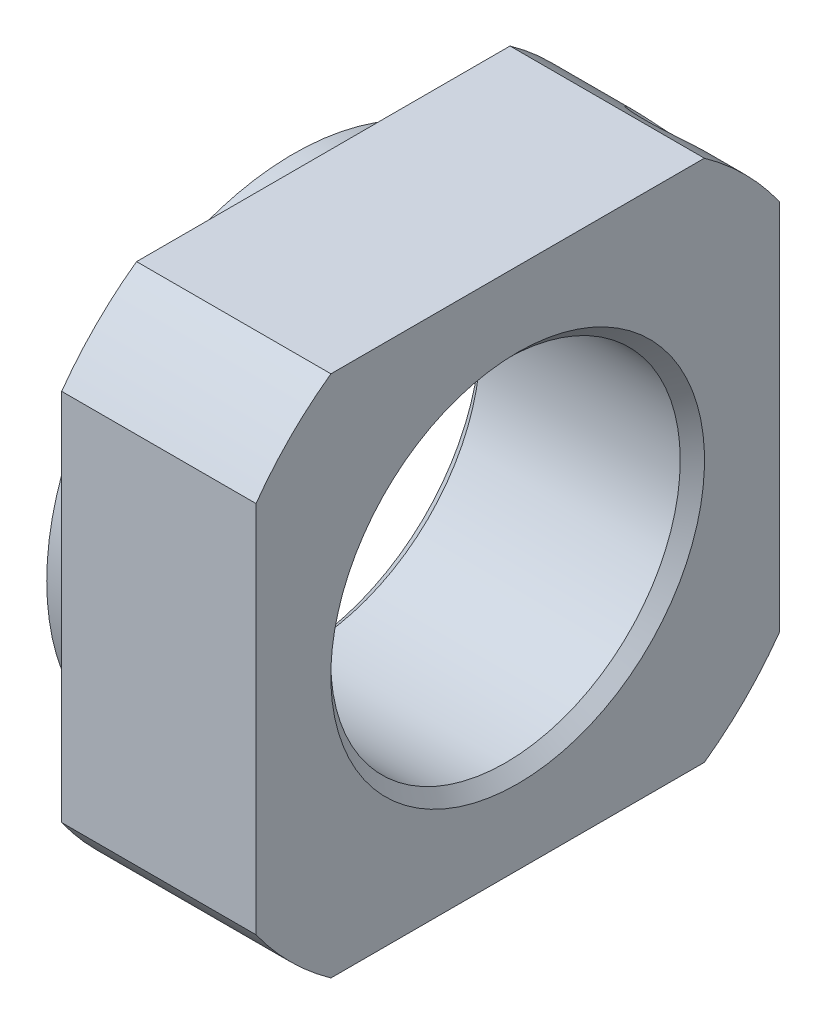
ISO-10303-21;
HEADER;
FILE_DESCRIPTION(('STEP AP214'),'2;1');
FILE_NAME('part.step','',(''),(''),'','','');
FILE_SCHEMA(('AUTOMOTIVE_DESIGN { 1 0 10303 214 1 1 1 1 }'));
ENDSEC;
DATA;
#1=APPLICATION_CONTEXT('core data for automotive mechanical design processes');
#2=APPLICATION_PROTOCOL_DEFINITION('international standard','automotive_design',2000,#1);
#3=PRODUCT_CONTEXT('',#1,'mechanical');
#4=PRODUCT('Part','Part','',(#3));
#5=PRODUCT_RELATED_PRODUCT_CATEGORY('part','',(#4));
#6=PRODUCT_DEFINITION_FORMATION('','',#4);
#7=PRODUCT_DEFINITION_CONTEXT('part definition',#1,'design');
#8=PRODUCT_DEFINITION('design','',#6,#7);
#9=PRODUCT_DEFINITION_SHAPE('','',#8);
#10=(LENGTH_UNIT() NAMED_UNIT(*) SI_UNIT(.MILLI.,.METRE.));
#11=(NAMED_UNIT(*) PLANE_ANGLE_UNIT() SI_UNIT($,.RADIAN.));
#12=(NAMED_UNIT(*) SI_UNIT($,.STERADIAN.) SOLID_ANGLE_UNIT());
#13=UNCERTAINTY_MEASURE_WITH_UNIT(LENGTH_MEASURE(1.E-05),#10,'distance_accuracy_value','');
#14=(GEOMETRIC_REPRESENTATION_CONTEXT(3) GLOBAL_UNCERTAINTY_ASSIGNED_CONTEXT((#13)) GLOBAL_UNIT_ASSIGNED_CONTEXT((#10,
#11,#12)) REPRESENTATION_CONTEXT('',''));
#15=CARTESIAN_POINT('',(0.,0.,0.));
#16=DIRECTION('',(0.,0.,1.));
#17=DIRECTION('',(1.,0.,0.));
#18=AXIS2_PLACEMENT_3D('',#15,#16,#17);
#19=CARTESIAN_POINT('',(0.,1.31838984174237E-13,-1.31838984174237E-13));
#20=DIRECTION('',(1.,0.,0.));
#21=DIRECTION('',(0.,0.,-1.));
#22=AXIS2_PLACEMENT_3D('',#19,#20,#21);
#23=PLANE('',#22);
#24=CARTESIAN_POINT('',(0.,0.,0.));
#25=DIRECTION('',(-1.,0.,0.));
#26=DIRECTION('',(0.,0.,1.));
#27=AXIS2_PLACEMENT_3D('',#24,#25,#26);
#28=CIRCLE('',#27,16.5);
#29=CARTESIAN_POINT('',(0.,0.,16.5));
#30=VERTEX_POINT('',#29);
#31=EDGE_CURVE('E168',#30,#30,#28,.T.);
#32=ORIENTED_EDGE('',*,*,#31,.F.);
#33=EDGE_LOOP('',(#32));
#34=FACE_BOUND('',#33,.T.);
#35=CARTESIAN_POINT('',(0.,-1.97758476261356E-13,-2.09901540593194E-13));
#36=DIRECTION('',(1.,0.,0.));
#37=DIRECTION('',(0.,0.,-1.));
#38=AXIS2_PLACEMENT_3D('',#35,#36,#37);
#39=CIRCLE('',#38,21.5000000000003);
#40=CARTESIAN_POINT('',(0.,17.5,12.4899959967968));
#41=VERTEX_POINT('',#40);
#42=CARTESIAN_POINT('',(0.,12.4899959967968,17.5));
#43=VERTEX_POINT('',#42);
#44=EDGE_CURVE('E165',#41,#43,#39,.T.);
#45=ORIENTED_EDGE('',*,*,#44,.F.);
#46=DIRECTION('',(0.,0.,-1.));
#47=VECTOR('',#46,1.);
#48=CARTESIAN_POINT('',(0.,17.5,-12.4899959967968));
#49=LINE('',#48,#47);
#50=CARTESIAN_POINT('',(0.,17.5,-12.4899959967968));
#51=VERTEX_POINT('',#50);
#52=EDGE_CURVE('E180',#41,#51,#49,.T.);
#53=ORIENTED_EDGE('',*,*,#52,.T.);
#54=CARTESIAN_POINT('',(0.,-2.09901540593194E-13,1.97758476261356E-13));
#55=DIRECTION('',(1.,0.,0.));
#56=DIRECTION('',(0.,0.,-1.));
#57=AXIS2_PLACEMENT_3D('',#54,#55,#56);
#58=CIRCLE('',#57,21.5000000000003);
#59=CARTESIAN_POINT('',(0.,12.4899959967968,-17.5));
#60=VERTEX_POINT('',#59);
#61=EDGE_CURVE('E171',#60,#51,#58,.T.);
#62=ORIENTED_EDGE('',*,*,#61,.F.);
#63=DIRECTION('',(0.,1.,0.));
#64=VECTOR('',#63,1.);
#65=CARTESIAN_POINT('',(0.,-12.4899959967968,-17.5));
#66=LINE('',#65,#64);
#67=CARTESIAN_POINT('',(0.,-12.4899959967968,-17.5));
#68=VERTEX_POINT('',#67);
#69=EDGE_CURVE('E177',#60,#68,#66,.F.);
#70=ORIENTED_EDGE('',*,*,#69,.T.);
#71=CARTESIAN_POINT('',(0.,2.46330733588707E-13,2.39391839684799E-13));
#72=DIRECTION('',(1.,0.,0.));
#73=DIRECTION('',(0.,0.,-1.));
#74=AXIS2_PLACEMENT_3D('',#71,#72,#73);
#75=CIRCLE('',#74,21.5000000000003);
#76=CARTESIAN_POINT('',(0.,-17.5,-12.4899959967967));
#77=VERTEX_POINT('',#76);
#78=EDGE_CURVE('E104',#77,#68,#75,.T.);
#79=ORIENTED_EDGE('',*,*,#78,.F.);
#80=DIRECTION('',(0.,0.,1.));
#81=VECTOR('',#80,1.);
#82=CARTESIAN_POINT('',(0.,-17.5,12.4899959967968));
#83=LINE('',#82,#81);
#84=CARTESIAN_POINT('',(0.,-17.5,12.4899959967968));
#85=VERTEX_POINT('',#84);
#86=EDGE_CURVE('E97',#77,#85,#83,.T.);
#87=ORIENTED_EDGE('',*,*,#86,.T.);
#88=CARTESIAN_POINT('',(0.,1.31838984174237E-13,-1.31838984174237E-13));
#89=DIRECTION('',(1.,0.,0.));
#90=DIRECTION('',(0.,0.,-1.));
#91=AXIS2_PLACEMENT_3D('',#88,#89,#90);
#92=CIRCLE('',#91,21.5000000000002);
#93=CARTESIAN_POINT('',(0.,-12.4899959967968,17.5));
#94=VERTEX_POINT('',#93);
#95=EDGE_CURVE('E19',#94,#85,#92,.T.);
#96=ORIENTED_EDGE('',*,*,#95,.F.);
#97=DIRECTION('',(0.,1.,0.));
#98=VECTOR('',#97,1.);
#99=CARTESIAN_POINT('',(0.,12.4899959967968,17.5));
#100=LINE('',#99,#98);
#101=EDGE_CURVE('E80',#94,#43,#100,.T.);
#102=ORIENTED_EDGE('',*,*,#101,.T.);
#103=EDGE_LOOP('',(#45,#53,#62,#70,#79,#87,#96,#102));
#104=FACE_BOUND('',#103,.T.);
#105=ADVANCED_FACE('F16',(#34,#104),#23,.F.);
#106=CARTESIAN_POINT('',(13.,12.4899959967968,17.5));
#107=DIRECTION('',(0.,0.,-1.));
#108=DIRECTION('',(-1.,0.,0.));
#109=AXIS2_PLACEMENT_3D('',#106,#107,#108);
#110=PLANE('',#109);
#111=DIRECTION('',(1.,0.,0.));
#112=VECTOR('',#111,1.);
#113=CARTESIAN_POINT('',(13.,-12.4899959967968,17.5));
#114=LINE('',#113,#112);
#115=CARTESIAN_POINT('',(13.,-12.4899959967968,17.5));
#116=VERTEX_POINT('',#115);
#117=EDGE_CURVE('E91',#116,#94,#114,.F.);
#118=ORIENTED_EDGE('',*,*,#117,.F.);
#119=DIRECTION('',(0.,1.,0.));
#120=VECTOR('',#119,1.);
#121=CARTESIAN_POINT('',(13.,1.31838984174237E-13,17.5));
#122=LINE('',#121,#120);
#123=CARTESIAN_POINT('',(13.,12.4899959967968,17.5));
#124=VERTEX_POINT('',#123);
#125=EDGE_CURVE('E159',#124,#116,#122,.F.);
#126=ORIENTED_EDGE('',*,*,#125,.F.);
#127=DIRECTION('',(1.,0.,0.));
#128=VECTOR('',#127,1.);
#129=CARTESIAN_POINT('',(13.,12.4899959967968,17.5));
#130=LINE('',#129,#128);
#131=EDGE_CURVE('E162',#43,#124,#130,.T.);
#132=ORIENTED_EDGE('',*,*,#131,.F.);
#133=ORIENTED_EDGE('',*,*,#101,.F.);
#134=EDGE_LOOP('',(#118,#126,#132,#133));
#135=FACE_BOUND('',#134,.T.);
#136=ADVANCED_FACE('F238',(#135),#110,.F.);
#137=CARTESIAN_POINT('',(13.,1.31838984174237E-13,-1.31838984174237E-13));
#138=DIRECTION('',(1.,0.,0.));
#139=DIRECTION('',(0.,0.,-1.));
#140=AXIS2_PLACEMENT_3D('',#137,#138,#139);
#141=CYLINDRICAL_SURFACE('',#140,21.5000000000002);
#142=CARTESIAN_POINT('',(13.,1.31838984174237E-13,-1.31838984174237E-13));
#143=DIRECTION('',(1.,0.,0.));
#144=DIRECTION('',(0.,0.,-1.));
#145=AXIS2_PLACEMENT_3D('',#142,#143,#144);
#146=CIRCLE('',#145,21.5000000000002);
#147=CARTESIAN_POINT('',(13.,-17.5,12.4899959967968));
#148=VERTEX_POINT('',#147);
#149=EDGE_CURVE('E158',#116,#148,#146,.T.);
#150=ORIENTED_EDGE('',*,*,#149,.F.);
#151=ORIENTED_EDGE('',*,*,#117,.T.);
#152=ORIENTED_EDGE('',*,*,#95,.T.);
#153=DIRECTION('',(1.,0.,0.));
#154=VECTOR('',#153,1.);
#155=CARTESIAN_POINT('',(13.,-17.5,12.4899959967968));
#156=LINE('',#155,#154);
#157=EDGE_CURVE('E89',#85,#148,#156,.T.);
#158=ORIENTED_EDGE('',*,*,#157,.T.);
#159=EDGE_LOOP('',(#150,#151,#152,#158));
#160=FACE_BOUND('',#159,.T.);
#161=ADVANCED_FACE('F88',(#160),#141,.T.);
#162=CARTESIAN_POINT('',(13.,-17.5,12.4899959967968));
#163=DIRECTION('',(0.,1.,0.));
#164=DIRECTION('',(0.,0.,1.));
#165=AXIS2_PLACEMENT_3D('',#162,#163,#164);
#166=PLANE('',#165);
#167=DIRECTION('',(1.,0.,0.));
#168=VECTOR('',#167,1.);
#169=CARTESIAN_POINT('',(13.,-17.5,-12.4899959967968));
#170=LINE('',#169,#168);
#171=CARTESIAN_POINT('',(13.,-17.5,-12.4899959967967));
#172=VERTEX_POINT('',#171);
#173=EDGE_CURVE('E106',#172,#77,#170,.F.);
#174=ORIENTED_EDGE('',*,*,#173,.F.);
#175=DIRECTION('',(0.,0.,-1.));
#176=VECTOR('',#175,1.);
#177=CARTESIAN_POINT('',(13.,-17.5,-1.31838984174237E-13));
#178=LINE('',#177,#176);
#179=EDGE_CURVE('E99',#148,#172,#178,.T.);
#180=ORIENTED_EDGE('',*,*,#179,.F.);
#181=ORIENTED_EDGE('',*,*,#157,.F.);
#182=ORIENTED_EDGE('',*,*,#86,.F.);
#183=EDGE_LOOP('',(#174,#180,#181,#182));
#184=FACE_BOUND('',#183,.T.);
#185=ADVANCED_FACE('F96',(#184),#166,.F.);
#186=CARTESIAN_POINT('',(13.,2.46330733588707E-13,2.39391839684799E-13));
#187=DIRECTION('',(1.,0.,0.));
#188=DIRECTION('',(0.,0.,-1.));
#189=AXIS2_PLACEMENT_3D('',#186,#187,#188);
#190=CYLINDRICAL_SURFACE('',#189,21.5000000000003);
#191=CARTESIAN_POINT('',(13.,2.46330733588707E-13,2.39391839684799E-13));
#192=DIRECTION('',(1.,0.,0.));
#193=DIRECTION('',(0.,0.,-1.));
#194=AXIS2_PLACEMENT_3D('',#191,#192,#193);
#195=CIRCLE('',#194,21.5000000000003);
#196=CARTESIAN_POINT('',(13.,-12.4899959967968,-17.5));
#197=VERTEX_POINT('',#196);
#198=EDGE_CURVE('E156',#172,#197,#195,.T.);
#199=ORIENTED_EDGE('',*,*,#198,.F.);
#200=ORIENTED_EDGE('',*,*,#173,.T.);
#201=ORIENTED_EDGE('',*,*,#78,.T.);
#202=DIRECTION('',(1.,0.,0.));
#203=VECTOR('',#202,1.);
#204=CARTESIAN_POINT('',(13.,-12.4899959967968,-17.5));
#205=LINE('',#204,#203);
#206=EDGE_CURVE('E174',#68,#197,#205,.T.);
#207=ORIENTED_EDGE('',*,*,#206,.T.);
#208=EDGE_LOOP('',(#199,#200,#201,#207));
#209=FACE_BOUND('',#208,.T.);
#210=ADVANCED_FACE('F230',(#209),#190,.T.);
#211=CARTESIAN_POINT('',(13.,-12.4899959967968,-17.5));
#212=DIRECTION('',(0.,0.,1.));
#213=DIRECTION('',(1.,0.,0.));
#214=AXIS2_PLACEMENT_3D('',#211,#212,#213);
#215=PLANE('',#214);
#216=DIRECTION('',(1.,0.,0.));
#217=VECTOR('',#216,1.);
#218=CARTESIAN_POINT('',(13.,12.4899959967968,-17.5));
#219=LINE('',#218,#217);
#220=CARTESIAN_POINT('',(13.,12.4899959967968,-17.5));
#221=VERTEX_POINT('',#220);
#222=EDGE_CURVE('E161',#221,#60,#219,.F.);
#223=ORIENTED_EDGE('',*,*,#222,.F.);
#224=DIRECTION('',(0.,1.,0.));
#225=VECTOR('',#224,1.);
#226=CARTESIAN_POINT('',(13.,1.31838984174237E-13,-17.5));
#227=LINE('',#226,#225);
#228=EDGE_CURVE('E154',#197,#221,#227,.T.);
#229=ORIENTED_EDGE('',*,*,#228,.F.);
#230=ORIENTED_EDGE('',*,*,#206,.F.);
#231=ORIENTED_EDGE('',*,*,#69,.F.);
#232=EDGE_LOOP('',(#223,#229,#230,#231));
#233=FACE_BOUND('',#232,.T.);
#234=ADVANCED_FACE('F226',(#233),#215,.F.);
#235=CARTESIAN_POINT('',(13.,17.5,-12.4899959967968));
#236=DIRECTION('',(0.,-1.,0.));
#237=DIRECTION('',(0.,0.,-1.));
#238=AXIS2_PLACEMENT_3D('',#235,#236,#237);
#239=PLANE('',#238);
#240=DIRECTION('',(1.,0.,0.));
#241=VECTOR('',#240,1.);
#242=CARTESIAN_POINT('',(13.,17.5,12.4899959967968));
#243=LINE('',#242,#241);
#244=CARTESIAN_POINT('',(13.,17.5,12.4899959967968));
#245=VERTEX_POINT('',#244);
#246=EDGE_CURVE('E164',#245,#41,#243,.F.);
#247=ORIENTED_EDGE('',*,*,#246,.F.);
#248=DIRECTION('',(0.,0.,-1.));
#249=VECTOR('',#248,1.);
#250=CARTESIAN_POINT('',(13.,17.5,-1.31838984174237E-13));
#251=LINE('',#250,#249);
#252=CARTESIAN_POINT('',(13.,17.5,-12.4899959967968));
#253=VERTEX_POINT('',#252);
#254=EDGE_CURVE('E34',#253,#245,#251,.F.);
#255=ORIENTED_EDGE('',*,*,#254,.F.);
#256=DIRECTION('',(1.,0.,0.));
#257=VECTOR('',#256,1.);
#258=CARTESIAN_POINT('',(13.,17.5,-12.4899959967968));
#259=LINE('',#258,#257);
#260=EDGE_CURVE('E169',#51,#253,#259,.T.);
#261=ORIENTED_EDGE('',*,*,#260,.F.);
#262=ORIENTED_EDGE('',*,*,#52,.F.);
#263=EDGE_LOOP('',(#247,#255,#261,#262));
#264=FACE_BOUND('',#263,.T.);
#265=ADVANCED_FACE('F223',(#264),#239,.F.);
#266=CARTESIAN_POINT('',(13.,-1.97758476261356E-13,-2.09901540593194E-13));
#267=DIRECTION('',(1.,0.,0.));
#268=DIRECTION('',(0.,0.,-1.));
#269=AXIS2_PLACEMENT_3D('',#266,#267,#268);
#270=CYLINDRICAL_SURFACE('',#269,21.5000000000003);
#271=CARTESIAN_POINT('',(13.,-1.97758476261356E-13,-2.09901540593194E-13));
#272=DIRECTION('',(1.,0.,0.));
#273=DIRECTION('',(0.,0.,-1.));
#274=AXIS2_PLACEMENT_3D('',#271,#272,#273);
#275=CIRCLE('',#274,21.5000000000003);
#276=EDGE_CURVE('E152',#245,#124,#275,.T.);
#277=ORIENTED_EDGE('',*,*,#276,.F.);
#278=ORIENTED_EDGE('',*,*,#246,.T.);
#279=ORIENTED_EDGE('',*,*,#44,.T.);
#280=ORIENTED_EDGE('',*,*,#131,.T.);
#281=EDGE_LOOP('',(#277,#278,#279,#280));
#282=FACE_BOUND('',#281,.T.);
#283=ADVANCED_FACE('F219',(#282),#270,.T.);
#284=CARTESIAN_POINT('',(0.,0.,0.));
#285=DIRECTION('',(-1.,0.,0.));
#286=DIRECTION('',(0.,0.,1.));
#287=AXIS2_PLACEMENT_3D('',#284,#285,#286);
#288=CYLINDRICAL_SURFACE('',#287,16.5);
#289=CARTESIAN_POINT('',(-2.,0.,0.));
#290=DIRECTION('',(-1.,0.,0.));
#291=DIRECTION('',(0.,0.,1.));
#292=AXIS2_PLACEMENT_3D('',#289,#290,#291);
#293=CIRCLE('',#292,16.5);
#294=CARTESIAN_POINT('',(-2.,0.,16.5));
#295=VERTEX_POINT('',#294);
#296=EDGE_CURVE('E194',#295,#295,#293,.F.);
#297=ORIENTED_EDGE('',*,*,#296,.T.);
#298=EDGE_LOOP('',(#297));
#299=FACE_BOUND('',#298,.T.);
#300=ORIENTED_EDGE('',*,*,#31,.T.);
#301=EDGE_LOOP('',(#300));
#302=FACE_BOUND('',#301,.T.);
#303=ADVANCED_FACE('F215',(#299,#302),#288,.T.);
#304=CARTESIAN_POINT('',(13.,-2.09901540593194E-13,1.97758476261356E-13));
#305=DIRECTION('',(1.,0.,0.));
#306=DIRECTION('',(0.,0.,-1.));
#307=AXIS2_PLACEMENT_3D('',#304,#305,#306);
#308=CYLINDRICAL_SURFACE('',#307,21.5000000000003);
#309=CARTESIAN_POINT('',(6.1747350924286,14.0157210768637,-16.303667154641));
#310=CARTESIAN_POINT('',(6.25940992751398,13.9504955141547,-16.3597396202765));
#311=CARTESIAN_POINT('',(6.35049471448669,13.8896843576139,-16.4113359702357));
#312=CARTESIAN_POINT('',(6.54328010452503,13.7782742153301,-16.5049832110584));
#313=CARTESIAN_POINT('',(6.64499075708883,13.7276850321972,-16.5470249440629));
#314=CARTESIAN_POINT('',(6.87348569327616,13.6307644211755,-16.6269910061141));
#315=CARTESIAN_POINT('',(7.00169332219604,13.5863662853314,-16.6632172685202));
#316=CARTESIAN_POINT('',(7.26569350229031,13.5140767740236,-16.7218989661425));
#317=CARTESIAN_POINT('',(7.40148854463858,13.4861908552808,-16.7443498491573));
#318=CARTESIAN_POINT('',(7.6819507250166,13.447028167969,-16.7758189268236));
#319=CARTESIAN_POINT('',(7.82676179210579,13.4363735574815,-16.7843340771249));
#320=CARTESIAN_POINT('',(8.11664708171829,13.4339231038293,-16.7862953085254));
#321=CARTESIAN_POINT('',(8.26172132333373,13.4421286884206,-16.7797402487782));
#322=CARTESIAN_POINT('',(8.55012110397777,13.477401580717,-16.7514227213695));
#323=CARTESIAN_POINT('',(8.69339451977887,13.5047287921443,-16.7294506926763));
#324=CARTESIAN_POINT('',(8.97193560480896,13.5776918518271,-16.6702872116577));
#325=CARTESIAN_POINT('',(9.1072030689178,13.6233281689467,-16.6330953695792));
#326=CARTESIAN_POINT('',(9.36419222546164,13.7309035445168,-16.5443971268616));
#327=CARTESIAN_POINT('',(9.48604435366008,13.7926613420942,-16.4930495462997));
#328=CARTESIAN_POINT('',(9.713893669666,13.9307587433339,-16.376571364044));
#329=CARTESIAN_POINT('',(9.81989368742322,14.0070957387353,-16.3114432275074));
#330=CARTESIAN_POINT('',(10.008644667855,14.1687497980693,-16.1711943873373));
#331=CARTESIAN_POINT('',(10.0921127697466,14.2536281554891,-16.0965345317792));
#332=CARTESIAN_POINT('',(10.237650908198,14.4317534115329,-15.9370241903251));
#333=CARTESIAN_POINT('',(10.2997291084287,14.5249971002807,-15.8521776090043));
#334=CARTESIAN_POINT('',(10.3971433525008,14.7113230505667,-15.6793563858264));
#335=CARTESIAN_POINT('',(10.4337617663573,14.8041324639282,-15.591810034069));
#336=CARTESIAN_POINT('',(10.4840809744757,14.9913030097015,-15.411932078091));
#337=CARTESIAN_POINT('',(10.4977888502517,15.085663653527,-15.3196019616051));
#338=CARTESIAN_POINT('',(10.5016320853983,15.2687998378727,-15.1370324176694));
#339=CARTESIAN_POINT('',(10.4927676107938,15.3576396942485,-15.0468769429352));
#340=CARTESIAN_POINT('',(10.4539142083268,15.5314461487663,-14.8674068657041));
#341=CARTESIAN_POINT('',(10.4239265086083,15.616412971788,-14.778092214626));
#342=CARTESIAN_POINT('',(10.3441347100633,15.7799634145458,-14.6033228278298));
#343=CARTESIAN_POINT('',(10.2944124260168,15.8585717951064,-14.5178537579477));
#344=CARTESIAN_POINT('',(10.1768976035304,16.0080857996612,-14.3528257239791));
#345=CARTESIAN_POINT('',(10.109102514355,16.0789903343702,-14.2732675961718));
#346=CARTESIAN_POINT('',(9.95486938779373,16.2141985782643,-14.119512543238));
#347=CARTESIAN_POINT('',(9.86784817460394,16.2781728572239,-14.0456116418058));
#348=CARTESIAN_POINT('',(9.67939956568777,16.3954681339813,-13.9085147869166));
#349=CARTESIAN_POINT('',(9.57796874752441,16.4487865936453,-13.8453213844475));
#350=CARTESIAN_POINT('',(9.35778766537802,16.5466357730186,-13.7282551033819));
#351=CARTESIAN_POINT('',(9.23840263687376,16.5905470969396,-13.6750580209028));
#352=CARTESIAN_POINT('',(8.99012044995915,16.665303410564,-13.5838562464712));
#353=CARTESIAN_POINT('',(8.86122116854047,16.6961454735828,-13.5458549575189));
#354=CARTESIAN_POINT('',(8.59143474322631,16.7455374049013,-13.4847545555413));
#355=CARTESIAN_POINT('',(8.45026947211012,16.7634814391215,-13.4623911133439));
#356=CARTESIAN_POINT('',(8.16514244371132,16.7846230576896,-13.4360230534202));
#357=CARTESIAN_POINT('',(8.02118028202327,16.7878184933442,-13.4320211107437));
#358=CARTESIAN_POINT('',(7.73122909367656,16.779339050517,-13.4426125542454));
#359=CARTESIAN_POINT('',(7.58526404829645,16.7673393640206,-13.4576121157281));
#360=CARTESIAN_POINT('',(7.29863012744846,16.7280191362846,-13.5064558071908));
#361=CARTESIAN_POINT('',(7.15796153631706,16.7006977737593,-13.540300947347));
#362=CARTESIAN_POINT('',(6.88642121362329,16.6311062171496,-13.6256859261318));
#363=CARTESIAN_POINT('',(6.75552432822366,16.5888761296057,-13.6771782805446));
#364=CARTESIAN_POINT('',(6.50718988325532,16.4899569278156,-13.7962780651118));
#365=CARTESIAN_POINT('',(6.3897509769615,16.4332692621576,-13.863883880721));
#366=CARTESIAN_POINT('',(6.17544305115927,16.3081060848319,-14.010877994892));
#367=CARTESIAN_POINT('',(6.07808179264435,16.240014074424,-14.089874014942));
#368=CARTESIAN_POINT('',(5.90334718485694,16.0922230530133,-14.2584317964557));
#369=CARTESIAN_POINT('',(5.82596717061009,16.0125279262711,-14.3479900202167));
#370=CARTESIAN_POINT('',(5.69769833106879,15.8477271224754,-14.5297555909856));
#371=CARTESIAN_POINT('',(5.64565035548543,15.7631115228167,-14.6215889227234));
#372=CARTESIAN_POINT('',(5.56443904239747,15.5872391378784,-14.8089311795279));
#373=CARTESIAN_POINT('',(5.53526679535918,15.495984953312,-14.9044386583853));
#374=CARTESIAN_POINT('',(5.50192443312274,15.3143023229855,-15.0909983827232));
#375=CARTESIAN_POINT('',(5.49655182395398,15.2240703751905,-15.1820286449385));
#376=CARTESIAN_POINT('',(5.50773499695799,15.0426659502286,-15.3617869681712));
#377=CARTESIAN_POINT('',(5.52429076593136,14.9514934736278,-15.4505150305742));
#378=CARTESIAN_POINT('',(5.57816215740481,14.772647598837,-15.6215856678443));
#379=CARTESIAN_POINT('',(5.61509349345382,14.6849407093623,-15.7040152118762));
#380=CARTESIAN_POINT('',(5.70807882295964,14.5138849693782,-15.8622417565082));
#381=CARTESIAN_POINT('',(5.76412183730154,14.430533648353,-15.938042533803));
#382=CARTESIAN_POINT('',(5.87733160655523,14.2903880399929,-16.063665981214));
#383=CARTESIAN_POINT('',(5.93077250032748,14.2321342033313,-16.1152690487959));
#384=CARTESIAN_POINT('',(6.04641956104704,14.1202643522963,-16.213379177622));
#385=CARTESIAN_POINT('',(6.10862357055963,14.0666472016221,-16.2598874881749));
#386=CARTESIAN_POINT('',(6.1747350924286,14.0157210768637,-16.303667154641));
#387=B_SPLINE_CURVE_WITH_KNOTS('',3,(#309,#310,#311,#312,#313,#314,#315,#316,#317,#318,#319,
#320,#321,#322,#323,#324,#325,#326,#327,#328,#329,#330,#331,#332,#333,#334,#335,#336,#337,#338,
#339,#340,#341,#342,#343,#344,#345,#346,#347,#348,#349,#350,#351,#352,#353,#354,#355,#356,#357,
#358,#359,#360,#361,#362,#363,#364,#365,#366,#367,#368,#369,#370,#371,#372,#373,#374,#375,#376,
#377,#378,#379,#380,#381,#382,#383,#384,#385,#386),.UNSPECIFIED.,.T.,.F.,(4,2,2,2,2,2,2,2,2,2,2,
2,2,2,2,2,2,2,2,2,2,2,2,2,2,2,2,2,2,2,2,2,2,2,2,2,2,2,4),(0.,0.361833237001793,
0.724011832959749,1.14337274113016,1.56287215645217,1.99720488917614,2.43157050287907,
2.87195774169112,3.31235625876585,3.74800182814541,4.18356953214744,4.60296354969337,
5.0221973235377,5.41838717589851,5.81445454561617,6.19328059119181,6.57208461292774,
6.94933434014904,7.32663733935897,7.71752028848145,8.10849623222821,8.52029869343376,
8.93219332357199,9.362355790167,9.7925809242759,10.2321596439351,10.6717619285242,
11.1101905219327,11.5485752038932,11.9744220658399,12.4001266976303,12.8039055825165,
13.2075271272402,13.5905041827675,13.9734810077687,14.3494702083741,14.7252437767386,
15.0078215513216,15.2903298778727),.UNSPECIFIED.);
#388=CARTESIAN_POINT('',(6.1747350924286,14.0157210768637,-16.303667154641));
#389=VERTEX_POINT('',#388);
#390=EDGE_CURVE('E197',#389,#389,#387,.T.);
#391=ORIENTED_EDGE('',*,*,#390,.T.);
#392=EDGE_LOOP('',(#391));
#393=FACE_BOUND('',#392,.T.);
#394=CARTESIAN_POINT('',(13.,-2.09901540593194E-13,1.97758476261356E-13));
#395=DIRECTION('',(1.,0.,0.));
#396=DIRECTION('',(0.,0.,-1.));
#397=AXIS2_PLACEMENT_3D('',#394,#395,#396);
#398=CIRCLE('',#397,21.5000000000003);
#399=EDGE_CURVE('E153',#221,#253,#398,.T.);
#400=ORIENTED_EDGE('',*,*,#399,.F.);
#401=ORIENTED_EDGE('',*,*,#222,.T.);
#402=ORIENTED_EDGE('',*,*,#61,.T.);
#403=ORIENTED_EDGE('',*,*,#260,.T.);
#404=EDGE_LOOP('',(#400,#401,#402,#403));
#405=FACE_BOUND('',#404,.T.);
#406=ADVANCED_FACE('F209',(#393,#405),#308,.T.);
#407=CARTESIAN_POINT('',(13.,1.31838984174237E-13,-1.31838984174237E-13));
#408=DIRECTION('',(1.,0.,0.));
#409=DIRECTION('',(0.,0.,-1.));
#410=AXIS2_PLACEMENT_3D('',#407,#408,#409);
#411=PLANE('',#410);
#412=CARTESIAN_POINT('',(13.,0.,0.));
#413=DIRECTION('',(1.,0.,0.));
#414=DIRECTION('',(0.,1.,0.));
#415=AXIS2_PLACEMENT_3D('',#412,#413,#414);
#416=CIRCLE('',#415,12.5);
#417=CARTESIAN_POINT('',(13.,12.5,0.));
#418=VERTEX_POINT('',#417);
#419=EDGE_CURVE('E204',#418,#418,#416,.F.);
#420=ORIENTED_EDGE('',*,*,#419,.T.);
#421=EDGE_LOOP('',(#420));
#422=FACE_BOUND('',#421,.T.);
#423=ORIENTED_EDGE('',*,*,#254,.T.);
#424=ORIENTED_EDGE('',*,*,#276,.T.);
#425=ORIENTED_EDGE('',*,*,#125,.T.);
#426=ORIENTED_EDGE('',*,*,#149,.T.);
#427=ORIENTED_EDGE('',*,*,#179,.T.);
#428=ORIENTED_EDGE('',*,*,#198,.T.);
#429=ORIENTED_EDGE('',*,*,#228,.T.);
#430=ORIENTED_EDGE('',*,*,#399,.T.);
#431=EDGE_LOOP('',(#423,#424,#425,#426,#427,#428,#429,#430));
#432=FACE_BOUND('',#431,.T.);
#433=ADVANCED_FACE('F214',(#422,#432),#411,.T.);
#434=CARTESIAN_POINT('',(-2.,0.,0.));
#435=DIRECTION('',(1.,0.,0.));
#436=DIRECTION('',(0.,0.,-1.));
#437=AXIS2_PLACEMENT_3D('',#434,#435,#436);
#438=PLANE('',#437);
#439=CARTESIAN_POINT('',(-2.,0.,0.));
#440=DIRECTION('',(-1.,0.,0.));
#441=DIRECTION('',(0.,0.,1.));
#442=AXIS2_PLACEMENT_3D('',#439,#440,#441);
#443=CIRCLE('',#442,12.5);
#444=CARTESIAN_POINT('',(-2.,0.,12.5));
#445=VERTEX_POINT('',#444);
#446=EDGE_CURVE('E115',#445,#445,#443,.F.);
#447=ORIENTED_EDGE('',*,*,#446,.T.);
#448=EDGE_LOOP('',(#447));
#449=FACE_BOUND('',#448,.T.);
#450=ORIENTED_EDGE('',*,*,#296,.F.);
#451=EDGE_LOOP('',(#450));
#452=FACE_BOUND('',#451,.T.);
#453=ADVANCED_FACE('F253',(#449,#452),#438,.F.);
#454=CARTESIAN_POINT('',(8.,15.2051782241397,-15.2051782241397));
#455=DIRECTION('',(0.,0.707106781186548,-0.707106781186548));
#456=DIRECTION('',(0.,0.707106781186548,0.707106781186548));
#457=AXIS2_PLACEMENT_3D('',#454,#455,#456);
#458=CONICAL_SURFACE('',#457,2.50336926287836,0.785398163397443);
#459=ORIENTED_EDGE('',*,*,#390,.F.);
#460=EDGE_LOOP('',(#459));
#461=FACE_BOUND('',#460,.T.);
#462=CARTESIAN_POINT('',(8.,14.896618559257,-14.896618559257));
#463=DIRECTION('',(0.,0.707106781186547,-0.707106781186548));
#464=DIRECTION('',(0.,0.707106781186548,0.707106781186547));
#465=AXIS2_PLACEMENT_3D('',#462,#463,#464);
#466=CIRCLE('',#465,2.067);
#467=CARTESIAN_POINT('',(8.,16.3582082759696,-13.4350288425444));
#468=VERTEX_POINT('',#467);
#469=EDGE_CURVE('E139',#468,#468,#466,.F.);
#470=ORIENTED_EDGE('',*,*,#469,.T.);
#471=EDGE_LOOP('',(#470));
#472=FACE_BOUND('',#471,.T.);
#473=ADVANCED_FACE('F205',(#461,#472),#458,.F.);
#474=CARTESIAN_POINT('',(13.,0.,0.));
#475=DIRECTION('',(1.,0.,0.));
#476=DIRECTION('',(0.,1.,0.));
#477=AXIS2_PLACEMENT_3D('',#474,#475,#476);
#478=CONICAL_SURFACE('',#477,12.5,0.785398163397448);
#479=CARTESIAN_POINT('',(12.188,0.,0.));
#480=DIRECTION('',(-1.,0.,0.));
#481=DIRECTION('',(0.,0.,1.));
#482=AXIS2_PLACEMENT_3D('',#479,#480,#481);
#483=CIRCLE('',#482,11.688);
#484=CARTESIAN_POINT('',(12.188,0.,11.688));
#485=VERTEX_POINT('',#484);
#486=EDGE_CURVE('E137',#485,#485,#483,.T.);
#487=ORIENTED_EDGE('',*,*,#486,.T.);
#488=EDGE_LOOP('',(#487));
#489=FACE_BOUND('',#488,.T.);
#490=ORIENTED_EDGE('',*,*,#419,.F.);
#491=EDGE_LOOP('',(#490));
#492=FACE_BOUND('',#491,.T.);
#493=ADVANCED_FACE('F268',(#489,#492),#478,.F.);
#494=CARTESIAN_POINT('',(-2.,0.,0.));
#495=DIRECTION('',(-1.,0.,0.));
#496=DIRECTION('',(0.,0.,1.));
#497=AXIS2_PLACEMENT_3D('',#494,#495,#496);
#498=CONICAL_SURFACE('',#497,12.5,0.785398163397449);
#499=ORIENTED_EDGE('',*,*,#446,.F.);
#500=EDGE_LOOP('',(#499));
#501=FACE_BOUND('',#500,.T.);
#502=CARTESIAN_POINT('',(-1.188,0.,0.));
#503=DIRECTION('',(-1.,0.,0.));
#504=DIRECTION('',(0.,0.,1.));
#505=AXIS2_PLACEMENT_3D('',#502,#503,#504);
#506=CIRCLE('',#505,11.688);
#507=CARTESIAN_POINT('',(-1.188,0.,11.688));
#508=VERTEX_POINT('',#507);
#509=EDGE_CURVE('E25',#508,#508,#506,.F.);
#510=ORIENTED_EDGE('',*,*,#509,.T.);
#511=EDGE_LOOP('',(#510));
#512=FACE_BOUND('',#511,.T.);
#513=ADVANCED_FACE('F128',(#501,#512),#498,.F.);
#514=CARTESIAN_POINT('',(8.,0.,0.));
#515=DIRECTION('',(0.,0.707106781186547,-0.707106781186548));
#516=DIRECTION('',(0.,0.707106781186548,0.707106781186547));
#517=AXIS2_PLACEMENT_3D('',#514,#515,#516);
#518=CYLINDRICAL_SURFACE('',#517,2.067);
#519=ORIENTED_EDGE('',*,*,#469,.F.);
#520=EDGE_LOOP('',(#519));
#521=FACE_BOUND('',#520,.T.);
#522=CARTESIAN_POINT('',(8.10224759596262,6.67491869459657,-9.5945194991998));
#523=CARTESIAN_POINT('',(8.21743561567122,6.67968135738911,-9.59120766659518));
#524=CARTESIAN_POINT('',(8.33219078057858,6.69250982926788,-9.58229133059995));
#525=CARTESIAN_POINT('',(8.55748686075767,6.73376150591866,-9.55334594657865));
#526=CARTESIAN_POINT('',(8.66802379042367,6.76219908698091,-9.53330665390375));
#527=CARTESIAN_POINT('',(8.88161185856691,6.83342067948054,-9.48238421406302));
#528=CARTESIAN_POINT('',(8.98466982535669,6.87619139903732,-9.45151111241774));
#529=CARTESIAN_POINT('',(9.18058730371635,6.97434800373786,-9.37931293371311));
#530=CARTESIAN_POINT('',(9.27344789488341,7.02973255154224,-9.33798896462113));
#531=CARTESIAN_POINT('',(9.44738743959928,7.15163120536594,-9.24496823526154));
#532=CARTESIAN_POINT('',(9.52833720546367,7.21825259787625,-9.19317042241978));
#533=CARTESIAN_POINT('',(9.67509346525403,7.35978043835548,-9.08026189885514));
#534=CARTESIAN_POINT('',(9.74089926238793,7.43468726731253,-9.01915075982994));
#535=CARTESIAN_POINT('',(9.8557340625025,7.59047831013515,-8.88843912337962));
#536=CARTESIAN_POINT('',(9.90469292233573,7.67138585015276,-8.81880473058804));
#537=CARTESIAN_POINT('',(9.98398212259951,7.83613901463696,-8.67273747050953));
#538=CARTESIAN_POINT('',(10.014314039624,7.91998438980851,-8.59630517922729));
#539=CARTESIAN_POINT('',(10.055156131742,8.08685958985512,-8.43949018808808));
#540=CARTESIAN_POINT('',(10.0658994852025,8.16988714730333,-8.35916580405138));
#541=CARTESIAN_POINT('',(10.0679394371412,8.33361613474123,-8.19594686303352));
#542=CARTESIAN_POINT('',(10.0592372541639,8.41431771016641,-8.11305246742183));
#543=CARTESIAN_POINT('',(10.0228354545693,8.57042191713393,-7.94795611747926));
#544=CARTESIAN_POINT('',(9.99531350502357,8.64586689619738,-7.86575490355756));
#545=CARTESIAN_POINT('',(9.92228990222502,8.79045269529009,-7.7038351715339));
#546=CARTESIAN_POINT('',(9.87678737969689,8.85959321032953,-7.62411677366535));
#547=CARTESIAN_POINT('',(9.76871247239237,8.99061371576168,-7.4691760894432));
#548=CARTESIAN_POINT('',(9.70601432950636,9.05243521434299,-7.39399211011473));
#549=CARTESIAN_POINT('',(9.56545393648442,9.16710087144682,-7.25134437715383));
#550=CARTESIAN_POINT('',(9.48759034364798,9.21994423429766,-7.1838813079464));
#551=CARTESIAN_POINT('',(9.31769992590186,9.3164634417226,-7.05827330032414));
#552=CARTESIAN_POINT('',(9.22550179568346,9.360010880731,-7.00026121114562));
#553=CARTESIAN_POINT('',(9.03023198600837,9.43644453051598,-6.8968838188013));
#554=CARTESIAN_POINT('',(8.92716041376221,9.46933084639663,-6.85151839095736));
#555=CARTESIAN_POINT('',(8.71316686918246,9.52397420678815,-6.77535722760368));
#556=CARTESIAN_POINT('',(8.60225658615164,9.54574744077821,-6.74454030285519));
#557=CARTESIAN_POINT('',(8.37562919079872,9.57795588324226,-6.69872370578103));
#558=CARTESIAN_POINT('',(8.25991257480068,9.58839225940518,-6.68372240446124));
#559=CARTESIAN_POINT('',(8.02870136618411,9.59773030593824,-6.6703060854141));
#560=CARTESIAN_POINT('',(7.91322654633362,9.59679216211602,-6.67166072803522));
#561=CARTESIAN_POINT('',(7.68421611637196,9.58378063579263,-6.69033774445362));
#562=CARTESIAN_POINT('',(7.57068045713149,9.57170753582685,-6.70765971310026));
#563=CARTESIAN_POINT('',(7.34928441496583,9.53665881541108,-6.75739548545814));
#564=CARTESIAN_POINT('',(7.24140034755713,9.51373355595107,-6.78973956399262));
#565=CARTESIAN_POINT('',(7.03369411118366,9.45728219491741,-6.86814963575512));
#566=CARTESIAN_POINT('',(6.93387256348937,9.42375527739243,-6.91421668514897));
#567=CARTESIAN_POINT('',(6.74381447021548,9.34605440621769,-7.0188956992375));
#568=CARTESIAN_POINT('',(6.65370824283572,9.30175675771851,-7.07765245054255));
#569=CARTESIAN_POINT('',(6.48691277263643,9.2033473381956,-7.20515184003818));
#570=CARTESIAN_POINT('',(6.41022445100478,9.14923489386956,-7.27389516325061));
#571=CARTESIAN_POINT('',(6.2716778174483,9.03146149836765,-7.41962909901119));
#572=CARTESIAN_POINT('',(6.20997508023592,8.96771067738126,-7.49669514449947));
#573=CARTESIAN_POINT('',(6.1041951920414,8.83227372468688,-7.65579413256329));
#574=CARTESIAN_POINT('',(6.0601170897746,8.76058802152864,-7.7378268067912));
#575=CARTESIAN_POINT('',(5.9911784998894,8.61143092516505,-7.90347539338741));
#576=CARTESIAN_POINT('',(5.96617918346507,8.53400591489195,-7.98707524327049));
#577=CARTESIAN_POINT('',(5.93565039918727,8.37488865478758,-8.15376303834696));
#578=CARTESIAN_POINT('',(5.93011923758119,8.29319677680647,-8.23685102744495));
#579=CARTESIAN_POINT('',(5.93864233420153,8.12895149472465,-8.39896648420947));
#580=CARTESIAN_POINT('',(5.95244355288953,8.04642299878956,-8.47803263451812));
#581=CARTESIAN_POINT('',(5.99875123702287,7.88196294265032,-8.63114318729001));
#582=CARTESIAN_POINT('',(6.03125788445192,7.80003138826162,-8.70518754088873));
#583=CARTESIAN_POINT('',(6.11405597819622,7.6392584781573,-8.84661306392303));
#584=CARTESIAN_POINT('',(6.16437114462368,7.56042140048514,-8.91398519234372));
#585=CARTESIAN_POINT('',(6.28133401726958,7.40855227257526,-9.04060205386907));
#586=CARTESIAN_POINT('',(6.34798274694293,7.3355205864811,-9.09984627731929));
#587=CARTESIAN_POINT('',(6.49678695148562,7.19683277369162,-9.20993481312426));
#588=CARTESIAN_POINT('',(6.57913987166549,7.13128969826524,-9.26065474629092));
#589=CARTESIAN_POINT('',(6.75651419737272,7.01114204093298,-9.35194852434133));
#590=CARTESIAN_POINT('',(6.85153836138513,6.95653984731433,-9.39252015442895));
#591=CARTESIAN_POINT('',(7.05220608833694,6.86015156297406,-9.46315312246235));
#592=CARTESIAN_POINT('',(7.15790630269302,6.81843918350426,-9.49315414365456));
#593=CARTESIAN_POINT('',(7.37643951103653,6.75003716337932,-9.54191416679108));
#594=CARTESIAN_POINT('',(7.48926530696024,6.72333262391884,-9.56068431921148));
#595=CARTESIAN_POINT('',(7.68588969926991,6.69140094462127,-9.58304457242568));
#596=CARTESIAN_POINT('',(7.76875854809067,6.6822150993573,-9.58944119825616));
#597=CARTESIAN_POINT('',(7.9352430907673,6.67225012594474,-9.59637738115085));
#598=CARTESIAN_POINT('',(8.01885876955457,6.6714708285611,-9.59691705612332));
#599=CARTESIAN_POINT('',(8.10224759596262,6.67491869459657,-9.5945194991998));
#600=B_SPLINE_CURVE_WITH_KNOTS('',3,(#522,#523,#524,#525,#526,#527,#528,#529,#530,#531,#532,
#533,#534,#535,#536,#537,#538,#539,#540,#541,#542,#543,#544,#545,#546,#547,#548,#549,#550,#551,
#552,#553,#554,#555,#556,#557,#558,#559,#560,#561,#562,#563,#564,#565,#566,#567,#568,#569,#570,
#571,#572,#573,#574,#575,#576,#577,#578,#579,#580,#581,#582,#583,#584,#585,#586,#587,#588,#589,
#590,#591,#592,#593,#594,#595,#596,#597,#598,#599),.UNSPECIFIED.,.T.,.F.,(4,2,2,2,2,2,2,2,2,2,2,
2,2,2,2,2,2,2,2,2,2,2,2,2,2,2,2,2,2,2,2,2,2,2,2,2,2,2,4),(0.,0.345695751013245,0.69171043002909,
1.03740511514031,1.38306316616443,1.73223059059767,2.08141407743031,2.43203429976753,
2.78262484133869,3.12901407536251,3.47538160369046,3.81852360620291,4.16168220003091,
4.50742063299529,4.85318969046286,5.20346349600385,5.55373384821961,5.90349246147453,
6.25321504640512,6.59801832464336,6.94281285417636,7.2860227711927,7.62925910962171,
7.97664073517999,8.32404620039664,8.67491735003814,9.02576955895222,9.37404374953523,
9.72228763910046,10.0660157529587,10.4097472109785,10.7539382368696,11.0981508351572,
11.4470166066658,11.7959584493874,12.1468603105224,12.4974132010158,12.7476800550364,
12.9979418708413),.UNSPECIFIED.);
#601=CARTESIAN_POINT('',(8.10224759596262,6.67491869459657,-9.5945194991998));
#602=VERTEX_POINT('',#601);
#603=EDGE_CURVE('E11',#602,#602,#600,.T.);
#604=ORIENTED_EDGE('',*,*,#603,.T.);
#605=EDGE_LOOP('',(#604));
#606=FACE_BOUND('',#605,.T.);
#607=ADVANCED_FACE('F117',(#521,#606),#518,.F.);
#608=CARTESIAN_POINT('',(13.,0.,0.));
#609=DIRECTION('',(-1.,0.,0.));
#610=DIRECTION('',(0.,0.,1.));
#611=AXIS2_PLACEMENT_3D('',#608,#609,#610);
#612=CYLINDRICAL_SURFACE('',#611,11.688);
#613=ORIENTED_EDGE('',*,*,#603,.F.);
#614=EDGE_LOOP('',(#613));
#615=FACE_BOUND('',#614,.T.);
#616=ORIENTED_EDGE('',*,*,#509,.F.);
#617=EDGE_LOOP('',(#616));
#618=FACE_BOUND('',#617,.T.);
#619=ORIENTED_EDGE('',*,*,#486,.F.);
#620=EDGE_LOOP('',(#619));
#621=FACE_BOUND('',#620,.T.);
#622=ADVANCED_FACE('F120',(#615,#618,#621),#612,.F.);
#623=CLOSED_SHELL('',(#105,#136,#161,#185,#210,#234,#265,#283,#303,#406,#433,#453,#473,#493,
#513,#607,#622));
#624=MANIFOLD_SOLID_BREP('B1',#623);
#625=ADVANCED_BREP_SHAPE_REPRESENTATION('',(#18,#624),#14);
#626=SHAPE_DEFINITION_REPRESENTATION(#9,#625);
ENDSEC;
END-ISO-10303-21;
